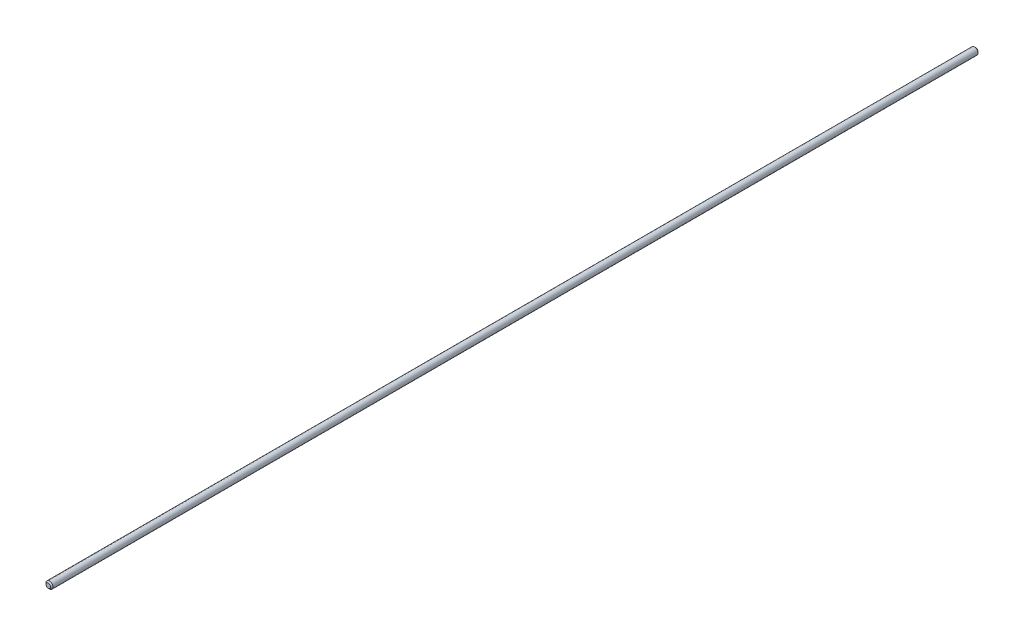
ISO-10303-21;
HEADER;
FILE_DESCRIPTION(('STEP AP214'),'2;1');
FILE_NAME('part.step','',(''),(''),'','','');
FILE_SCHEMA(('AUTOMOTIVE_DESIGN { 1 0 10303 214 1 1 1 1 }'));
ENDSEC;
DATA;
#1=APPLICATION_CONTEXT('core data for automotive mechanical design processes');
#2=APPLICATION_PROTOCOL_DEFINITION('international standard','automotive_design',2000,#1);
#3=PRODUCT_CONTEXT('',#1,'mechanical');
#4=PRODUCT('Part','Part','',(#3));
#5=PRODUCT_RELATED_PRODUCT_CATEGORY('part','',(#4));
#6=PRODUCT_DEFINITION_FORMATION('','',#4);
#7=PRODUCT_DEFINITION_CONTEXT('part definition',#1,'design');
#8=PRODUCT_DEFINITION('design','',#6,#7);
#9=PRODUCT_DEFINITION_SHAPE('','',#8);
#10=(LENGTH_UNIT() NAMED_UNIT(*) SI_UNIT(.MILLI.,.METRE.));
#11=(NAMED_UNIT(*) PLANE_ANGLE_UNIT() SI_UNIT($,.RADIAN.));
#12=(NAMED_UNIT(*) SI_UNIT($,.STERADIAN.) SOLID_ANGLE_UNIT());
#13=UNCERTAINTY_MEASURE_WITH_UNIT(LENGTH_MEASURE(1.E-05),#10,'distance_accuracy_value','');
#14=(GEOMETRIC_REPRESENTATION_CONTEXT(3) GLOBAL_UNCERTAINTY_ASSIGNED_CONTEXT((#13)) GLOBAL_UNIT_ASSIGNED_CONTEXT((#10,
#11,#12)) REPRESENTATION_CONTEXT('',''));
#15=CARTESIAN_POINT('',(0.,0.,0.));
#16=DIRECTION('',(0.,0.,1.));
#17=DIRECTION('',(1.,0.,0.));
#18=AXIS2_PLACEMENT_3D('',#15,#16,#17);
#19=CARTESIAN_POINT('',(0.,0.,800.));
#20=DIRECTION('',(0.,0.,-1.));
#21=DIRECTION('',(-1.,0.,0.));
#22=AXIS2_PLACEMENT_3D('',#19,#20,#21);
#23=CYLINDRICAL_SURFACE('',#22,3.);
#24=CARTESIAN_POINT('',(0.,0.,1.));
#25=DIRECTION('',(0.,0.,1.));
#26=DIRECTION('',(1.,0.,0.));
#27=AXIS2_PLACEMENT_3D('',#24,#25,#26);
#28=CIRCLE('',#27,3.);
#29=CARTESIAN_POINT('',(3.,0.,1.));
#30=VERTEX_POINT('',#29);
#31=EDGE_CURVE('E42',#30,#30,#28,.T.);
#32=ORIENTED_EDGE('',*,*,#31,.T.);
#33=EDGE_LOOP('',(#32));
#34=FACE_BOUND('',#33,.T.);
#35=CARTESIAN_POINT('',(0.,0.,799.));
#36=DIRECTION('',(0.,0.,1.));
#37=DIRECTION('',(1.,0.,0.));
#38=AXIS2_PLACEMENT_3D('',#35,#36,#37);
#39=CIRCLE('',#38,3.);
#40=CARTESIAN_POINT('',(3.,0.,799.));
#41=VERTEX_POINT('',#40);
#42=EDGE_CURVE('E46',#41,#41,#39,.F.);
#43=ORIENTED_EDGE('',*,*,#42,.T.);
#44=EDGE_LOOP('',(#43));
#45=FACE_BOUND('',#44,.T.);
#46=ADVANCED_FACE('F31',(#34,#45),#23,.T.);
#47=CARTESIAN_POINT('',(0.,0.,800.));
#48=DIRECTION('',(0.,0.,1.));
#49=DIRECTION('',(1.,0.,0.));
#50=AXIS2_PLACEMENT_3D('',#47,#48,#49);
#51=PLANE('',#50);
#52=CARTESIAN_POINT('',(0.,0.,800.));
#53=DIRECTION('',(0.,0.,1.));
#54=DIRECTION('',(1.,0.,0.));
#55=AXIS2_PLACEMENT_3D('',#52,#53,#54);
#56=CIRCLE('',#55,2.);
#57=CARTESIAN_POINT('',(2.,0.,800.));
#58=VERTEX_POINT('',#57);
#59=EDGE_CURVE('E10',#58,#58,#56,.T.);
#60=ORIENTED_EDGE('',*,*,#59,.T.);
#61=EDGE_LOOP('',(#60));
#62=FACE_BOUND('',#61,.T.);
#63=ADVANCED_FACE('F62',(#62),#51,.T.);
#64=CARTESIAN_POINT('',(0.,0.,0.));
#65=DIRECTION('',(0.,0.,1.));
#66=DIRECTION('',(1.,0.,0.));
#67=AXIS2_PLACEMENT_3D('',#64,#65,#66);
#68=PLANE('',#67);
#69=CARTESIAN_POINT('',(0.,0.,0.));
#70=DIRECTION('',(0.,0.,1.));
#71=DIRECTION('',(1.,0.,0.));
#72=AXIS2_PLACEMENT_3D('',#69,#70,#71);
#73=CIRCLE('',#72,2.00000000000011);
#74=CARTESIAN_POINT('',(2.00000000000011,0.,0.));
#75=VERTEX_POINT('',#74);
#76=EDGE_CURVE('E38',#75,#75,#73,.F.);
#77=ORIENTED_EDGE('',*,*,#76,.T.);
#78=EDGE_LOOP('',(#77));
#79=FACE_BOUND('',#78,.T.);
#80=ADVANCED_FACE('F59',(#79),#68,.F.);
#81=CARTESIAN_POINT('',(0.,0.,1.));
#82=DIRECTION('',(0.,0.,1.));
#83=DIRECTION('',(1.,0.,0.));
#84=AXIS2_PLACEMENT_3D('',#81,#82,#83);
#85=CONICAL_SURFACE('',#84,3.,0.785398163397391);
#86=ORIENTED_EDGE('',*,*,#76,.F.);
#87=EDGE_LOOP('',(#86));
#88=FACE_BOUND('',#87,.T.);
#89=ORIENTED_EDGE('',*,*,#31,.F.);
#90=EDGE_LOOP('',(#89));
#91=FACE_BOUND('',#90,.T.);
#92=ADVANCED_FACE('F55',(#88,#91),#85,.T.);
#93=CARTESIAN_POINT('',(0.,0.,800.));
#94=DIRECTION('',(0.,0.,-1.));
#95=DIRECTION('',(-1.,0.,0.));
#96=AXIS2_PLACEMENT_3D('',#93,#94,#95);
#97=CONICAL_SURFACE('',#96,2.,0.785398163397447);
#98=ORIENTED_EDGE('',*,*,#42,.F.);
#99=EDGE_LOOP('',(#98));
#100=FACE_BOUND('',#99,.T.);
#101=ORIENTED_EDGE('',*,*,#59,.F.);
#102=EDGE_LOOP('',(#101));
#103=FACE_BOUND('',#102,.T.);
#104=ADVANCED_FACE('F33',(#100,#103),#97,.T.);
#105=CLOSED_SHELL('',(#46,#63,#80,#92,#104));
#106=MANIFOLD_SOLID_BREP('B2',#105);
#107=ADVANCED_BREP_SHAPE_REPRESENTATION('',(#18,#106),#14);
#108=SHAPE_DEFINITION_REPRESENTATION(#9,#107);
ENDSEC;
END-ISO-10303-21;
